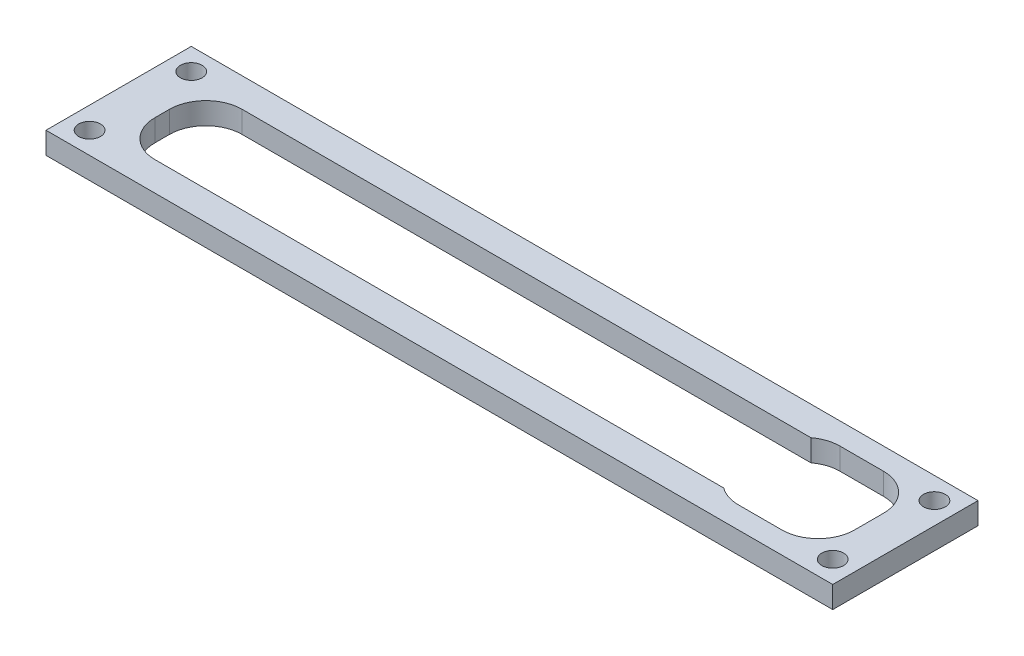
ISO-10303-21;
HEADER;
FILE_DESCRIPTION(('STEP AP214'),'2;1');
FILE_NAME('part.step','',(''),(''),'','','');
FILE_SCHEMA(('AUTOMOTIVE_DESIGN { 1 0 10303 214 1 1 1 1 }'));
ENDSEC;
DATA;
#1=APPLICATION_CONTEXT('core data for automotive mechanical design processes');
#2=APPLICATION_PROTOCOL_DEFINITION('international standard','automotive_design',2000,#1);
#3=PRODUCT_CONTEXT('',#1,'mechanical');
#4=PRODUCT('Part','Part','',(#3));
#5=PRODUCT_RELATED_PRODUCT_CATEGORY('part','',(#4));
#6=PRODUCT_DEFINITION_FORMATION('','',#4);
#7=PRODUCT_DEFINITION_CONTEXT('part definition',#1,'design');
#8=PRODUCT_DEFINITION('design','',#6,#7);
#9=PRODUCT_DEFINITION_SHAPE('','',#8);
#10=(LENGTH_UNIT() NAMED_UNIT(*) SI_UNIT(.MILLI.,.METRE.));
#11=(NAMED_UNIT(*) PLANE_ANGLE_UNIT() SI_UNIT($,.RADIAN.));
#12=(NAMED_UNIT(*) SI_UNIT($,.STERADIAN.) SOLID_ANGLE_UNIT());
#13=UNCERTAINTY_MEASURE_WITH_UNIT(LENGTH_MEASURE(1.E-05),#10,'distance_accuracy_value','');
#14=(GEOMETRIC_REPRESENTATION_CONTEXT(3) GLOBAL_UNCERTAINTY_ASSIGNED_CONTEXT((#13)) GLOBAL_UNIT_ASSIGNED_CONTEXT((#10,
#11,#12)) REPRESENTATION_CONTEXT('',''));
#15=CARTESIAN_POINT('',(0.,0.,0.));
#16=DIRECTION('',(0.,0.,1.));
#17=DIRECTION('',(1.,0.,0.));
#18=AXIS2_PLACEMENT_3D('',#15,#16,#17);
#19=CARTESIAN_POINT('',(0.,3.,0.));
#20=DIRECTION('',(0.,-1.,0.));
#21=DIRECTION('',(0.,0.,-1.));
#22=AXIS2_PLACEMENT_3D('',#19,#20,#21);
#23=PLANE('',#22);
#24=DIRECTION('',(0.,0.,1.));
#25=VECTOR('',#24,1.);
#26=CARTESIAN_POINT('',(0.,3.,0.));
#27=LINE('',#26,#25);
#28=CARTESIAN_POINT('',(0.,3.,-20.));
#29=VERTEX_POINT('',#28);
#30=CARTESIAN_POINT('',(0.,3.,0.));
#31=VERTEX_POINT('',#30);
#32=EDGE_CURVE('E249',#29,#31,#27,.T.);
#33=ORIENTED_EDGE('',*,*,#32,.T.);
#34=DIRECTION('',(1.,0.,0.));
#35=VECTOR('',#34,1.);
#36=CARTESIAN_POINT('',(0.,3.,0.));
#37=LINE('',#36,#35);
#38=CARTESIAN_POINT('',(108.320866353641,3.,0.));
#39=VERTEX_POINT('',#38);
#40=EDGE_CURVE('E252',#31,#39,#37,.T.);
#41=ORIENTED_EDGE('',*,*,#40,.T.);
#42=DIRECTION('',(0.,0.,-1.));
#43=VECTOR('',#42,1.);
#44=CARTESIAN_POINT('',(108.320866353641,3.,0.));
#45=LINE('',#44,#43);
#46=CARTESIAN_POINT('',(108.320866353641,3.,-20.));
#47=VERTEX_POINT('',#46);
#48=EDGE_CURVE('E255',#39,#47,#45,.T.);
#49=ORIENTED_EDGE('',*,*,#48,.T.);
#50=DIRECTION('',(-1.,0.,0.));
#51=VECTOR('',#50,1.);
#52=CARTESIAN_POINT('',(0.,3.,-20.));
#53=LINE('',#52,#51);
#54=EDGE_CURVE('E257',#47,#29,#53,.T.);
#55=ORIENTED_EDGE('',*,*,#54,.T.);
#56=EDGE_LOOP('',(#33,#41,#49,#55));
#57=FACE_BOUND('',#56,.T.);
#58=DIRECTION('',(-1.,0.,0.));
#59=VECTOR('',#58,1.);
#60=CARTESIAN_POINT('',(5.99999999999999,3.,-16.));
#61=LINE('',#60,#59);
#62=CARTESIAN_POINT('',(89.3208663536412,3.,-16.));
#63=VERTEX_POINT('',#62);
#64=CARTESIAN_POINT('',(11.,3.,-16.));
#65=VERTEX_POINT('',#64);
#66=EDGE_CURVE('E242',#63,#65,#61,.T.);
#67=ORIENTED_EDGE('',*,*,#66,.F.);
#68=CARTESIAN_POINT('',(92.3208663536412,3.,-12.));
#69=DIRECTION('',(0.,-1.,0.));
#70=DIRECTION('',(0.,0.,-1.));
#71=AXIS2_PLACEMENT_3D('',#68,#69,#70);
#72=CIRCLE('',#71,5.);
#73=CARTESIAN_POINT('',(92.3208663536412,3.,-17.));
#74=VERTEX_POINT('',#73);
#75=EDGE_CURVE('E192',#63,#74,#72,.T.);
#76=ORIENTED_EDGE('',*,*,#75,.T.);
#77=DIRECTION('',(-1.,0.,0.));
#78=VECTOR('',#77,1.);
#79=CARTESIAN_POINT('',(89.3208663536412,3.,-17.));
#80=LINE('',#79,#78);
#81=CARTESIAN_POINT('',(98.3208663536412,3.,-17.));
#82=VERTEX_POINT('',#81);
#83=EDGE_CURVE('E204',#82,#74,#80,.T.);
#84=ORIENTED_EDGE('',*,*,#83,.F.);
#85=CARTESIAN_POINT('',(98.3208663536412,3.,-12.));
#86=DIRECTION('',(0.,-1.,0.));
#87=DIRECTION('',(0.,0.,-1.));
#88=AXIS2_PLACEMENT_3D('',#85,#86,#87);
#89=CIRCLE('',#88,5.);
#90=CARTESIAN_POINT('',(103.320866353641,3.,-12.));
#91=VERTEX_POINT('',#90);
#92=EDGE_CURVE('E184',#82,#91,#89,.T.);
#93=ORIENTED_EDGE('',*,*,#92,.T.);
#94=DIRECTION('',(0.,0.,-1.));
#95=VECTOR('',#94,1.);
#96=CARTESIAN_POINT('',(103.320866353641,3.,-17.));
#97=LINE('',#96,#95);
#98=CARTESIAN_POINT('',(103.320866353641,3.,-8.00000000000001));
#99=VERTEX_POINT('',#98);
#100=EDGE_CURVE('E201',#99,#91,#97,.T.);
#101=ORIENTED_EDGE('',*,*,#100,.F.);
#102=CARTESIAN_POINT('',(98.3208663536412,3.,-8.00000000000001));
#103=DIRECTION('',(0.,-1.,0.));
#104=DIRECTION('',(0.,0.,-1.));
#105=AXIS2_PLACEMENT_3D('',#102,#103,#104);
#106=CIRCLE('',#105,5.);
#107=CARTESIAN_POINT('',(98.3208663536412,3.,-3.00000000000001));
#108=VERTEX_POINT('',#107);
#109=EDGE_CURVE('E188',#99,#108,#106,.T.);
#110=ORIENTED_EDGE('',*,*,#109,.T.);
#111=DIRECTION('',(1.,0.,0.));
#112=VECTOR('',#111,1.);
#113=CARTESIAN_POINT('',(89.3208663536412,3.,-3.00000000000001));
#114=LINE('',#113,#112);
#115=CARTESIAN_POINT('',(92.3208663536412,3.,-3.00000000000001));
#116=VERTEX_POINT('',#115);
#117=EDGE_CURVE('E199',#116,#108,#114,.T.);
#118=ORIENTED_EDGE('',*,*,#117,.F.);
#119=CARTESIAN_POINT('',(92.3208663536412,3.,-8.00000000000001));
#120=DIRECTION('',(0.,-1.,0.));
#121=DIRECTION('',(0.,0.,-1.));
#122=AXIS2_PLACEMENT_3D('',#119,#120,#121);
#123=CIRCLE('',#122,5.);
#124=CARTESIAN_POINT('',(89.3208663536412,3.,-4.00000000000002));
#125=VERTEX_POINT('',#124);
#126=EDGE_CURVE('E42',#116,#125,#123,.T.);
#127=ORIENTED_EDGE('',*,*,#126,.T.);
#128=DIRECTION('',(1.,0.,0.));
#129=VECTOR('',#128,1.);
#130=CARTESIAN_POINT('',(5.99999999999999,3.,-4.00000000000002));
#131=LINE('',#130,#129);
#132=CARTESIAN_POINT('',(11.,3.,-4.00000000000002));
#133=VERTEX_POINT('',#132);
#134=EDGE_CURVE('E161',#133,#125,#131,.T.);
#135=ORIENTED_EDGE('',*,*,#134,.F.);
#136=CARTESIAN_POINT('',(11.,3.,-9.00000000000001));
#137=DIRECTION('',(0.,-1.,0.));
#138=DIRECTION('',(0.,0.,-1.));
#139=AXIS2_PLACEMENT_3D('',#136,#137,#138);
#140=CIRCLE('',#139,5.);
#141=CARTESIAN_POINT('',(5.99999999999999,3.,-9.00000000000001));
#142=VERTEX_POINT('',#141);
#143=EDGE_CURVE('E178',#133,#142,#140,.T.);
#144=ORIENTED_EDGE('',*,*,#143,.T.);
#145=DIRECTION('',(0.,0.,1.));
#146=VECTOR('',#145,1.);
#147=CARTESIAN_POINT('',(5.99999999999999,3.,-16.));
#148=LINE('',#147,#146);
#149=CARTESIAN_POINT('',(5.99999999999999,3.,-11.));
#150=VERTEX_POINT('',#149);
#151=EDGE_CURVE('E238',#150,#142,#148,.T.);
#152=ORIENTED_EDGE('',*,*,#151,.F.);
#153=CARTESIAN_POINT('',(11.,3.,-11.));
#154=DIRECTION('',(0.,-1.,0.));
#155=DIRECTION('',(0.,0.,-1.));
#156=AXIS2_PLACEMENT_3D('',#153,#154,#155);
#157=CIRCLE('',#156,5.);
#158=EDGE_CURVE('E182',#150,#65,#157,.T.);
#159=ORIENTED_EDGE('',*,*,#158,.T.);
#160=EDGE_LOOP('',(#67,#76,#84,#93,#101,#110,#118,#127,#135,#144,#152,#159));
#161=FACE_BOUND('',#160,.T.);
#162=CARTESIAN_POINT('',(3.,3.,-17.));
#163=DIRECTION('',(0.,1.,0.));
#164=DIRECTION('',(0.,0.,1.));
#165=AXIS2_PLACEMENT_3D('',#162,#163,#164);
#166=CIRCLE('',#165,1.5);
#167=CARTESIAN_POINT('',(3.,3.,-15.5));
#168=VERTEX_POINT('',#167);
#169=EDGE_CURVE('E233',#168,#168,#166,.T.);
#170=ORIENTED_EDGE('',*,*,#169,.F.);
#171=EDGE_LOOP('',(#170));
#172=FACE_BOUND('',#171,.T.);
#173=CARTESIAN_POINT('',(3.,3.,-3.));
#174=DIRECTION('',(0.,1.,0.));
#175=DIRECTION('',(0.,0.,-1.));
#176=AXIS2_PLACEMENT_3D('',#173,#174,#175);
#177=CIRCLE('',#176,1.5);
#178=CARTESIAN_POINT('',(3.,3.,-4.5));
#179=VERTEX_POINT('',#178);
#180=EDGE_CURVE('E227',#179,#179,#177,.T.);
#181=ORIENTED_EDGE('',*,*,#180,.F.);
#182=EDGE_LOOP('',(#181));
#183=FACE_BOUND('',#182,.T.);
#184=CARTESIAN_POINT('',(105.320866353641,3.,-3.00000000000001));
#185=DIRECTION('',(0.,1.,0.));
#186=DIRECTION('',(0.,0.,1.));
#187=AXIS2_PLACEMENT_3D('',#184,#185,#186);
#188=CIRCLE('',#187,1.5);
#189=CARTESIAN_POINT('',(105.320866353641,3.,-1.50000000000001));
#190=VERTEX_POINT('',#189);
#191=EDGE_CURVE('E221',#190,#190,#188,.T.);
#192=ORIENTED_EDGE('',*,*,#191,.F.);
#193=EDGE_LOOP('',(#192));
#194=FACE_BOUND('',#193,.T.);
#195=CARTESIAN_POINT('',(105.320866353641,3.,-17.));
#196=DIRECTION('',(0.,1.,0.));
#197=DIRECTION('',(0.,0.,-1.));
#198=AXIS2_PLACEMENT_3D('',#195,#196,#197);
#199=CIRCLE('',#198,1.5);
#200=CARTESIAN_POINT('',(105.320866353641,3.,-18.5));
#201=VERTEX_POINT('',#200);
#202=EDGE_CURVE('E215',#201,#201,#199,.T.);
#203=ORIENTED_EDGE('',*,*,#202,.F.);
#204=EDGE_LOOP('',(#203));
#205=FACE_BOUND('',#204,.T.);
#206=ADVANCED_FACE('F34',(#57,#161,#172,#183,#194,#205),#23,.F.);
#207=CARTESIAN_POINT('',(0.,0.,0.));
#208=DIRECTION('',(0.,-1.,0.));
#209=DIRECTION('',(0.,0.,-1.));
#210=AXIS2_PLACEMENT_3D('',#207,#208,#209);
#211=PLANE('',#210);
#212=DIRECTION('',(-1.,0.,0.));
#213=VECTOR('',#212,1.);
#214=CARTESIAN_POINT('',(89.3208663536412,0.,-17.));
#215=LINE('',#214,#213);
#216=CARTESIAN_POINT('',(98.3208663536412,0.,-17.));
#217=VERTEX_POINT('',#216);
#218=CARTESIAN_POINT('',(92.3208663536412,0.,-17.));
#219=VERTEX_POINT('',#218);
#220=EDGE_CURVE('E164',#217,#219,#215,.T.);
#221=ORIENTED_EDGE('',*,*,#220,.T.);
#222=CARTESIAN_POINT('',(92.3208663536412,0.,-12.));
#223=DIRECTION('',(0.,-1.,0.));
#224=DIRECTION('',(0.,0.,-1.));
#225=AXIS2_PLACEMENT_3D('',#222,#223,#224);
#226=CIRCLE('',#225,5.);
#227=CARTESIAN_POINT('',(89.3208663536412,0.,-16.));
#228=VERTEX_POINT('',#227);
#229=EDGE_CURVE('E194',#219,#228,#226,.F.);
#230=ORIENTED_EDGE('',*,*,#229,.T.);
#231=DIRECTION('',(-1.,0.,0.));
#232=VECTOR('',#231,1.);
#233=CARTESIAN_POINT('',(5.99999999999999,0.,-16.));
#234=LINE('',#233,#232);
#235=CARTESIAN_POINT('',(11.,0.,-16.));
#236=VERTEX_POINT('',#235);
#237=EDGE_CURVE('E153',#228,#236,#234,.T.);
#238=ORIENTED_EDGE('',*,*,#237,.T.);
#239=CARTESIAN_POINT('',(11.,0.,-11.));
#240=DIRECTION('',(0.,-1.,0.));
#241=DIRECTION('',(0.,0.,-1.));
#242=AXIS2_PLACEMENT_3D('',#239,#240,#241);
#243=CIRCLE('',#242,5.);
#244=CARTESIAN_POINT('',(5.99999999999999,0.,-11.));
#245=VERTEX_POINT('',#244);
#246=EDGE_CURVE('E180',#236,#245,#243,.F.);
#247=ORIENTED_EDGE('',*,*,#246,.T.);
#248=DIRECTION('',(0.,0.,1.));
#249=VECTOR('',#248,1.);
#250=CARTESIAN_POINT('',(5.99999999999999,0.,-16.));
#251=LINE('',#250,#249);
#252=CARTESIAN_POINT('',(5.99999999999999,0.,-9.00000000000001));
#253=VERTEX_POINT('',#252);
#254=EDGE_CURVE('E154',#245,#253,#251,.T.);
#255=ORIENTED_EDGE('',*,*,#254,.T.);
#256=CARTESIAN_POINT('',(11.,0.,-9.00000000000001));
#257=DIRECTION('',(0.,-1.,0.));
#258=DIRECTION('',(0.,0.,-1.));
#259=AXIS2_PLACEMENT_3D('',#256,#257,#258);
#260=CIRCLE('',#259,5.);
#261=CARTESIAN_POINT('',(11.,0.,-4.00000000000002));
#262=VERTEX_POINT('',#261);
#263=EDGE_CURVE('E150',#253,#262,#260,.F.);
#264=ORIENTED_EDGE('',*,*,#263,.T.);
#265=DIRECTION('',(1.,0.,0.));
#266=VECTOR('',#265,1.);
#267=CARTESIAN_POINT('',(5.99999999999999,0.,-4.00000000000002));
#268=LINE('',#267,#266);
#269=CARTESIAN_POINT('',(89.3208663536412,0.,-4.00000000000002));
#270=VERTEX_POINT('',#269);
#271=EDGE_CURVE('E144',#262,#270,#268,.T.);
#272=ORIENTED_EDGE('',*,*,#271,.T.);
#273=CARTESIAN_POINT('',(92.3208663536412,0.,-8.00000000000001));
#274=DIRECTION('',(0.,-1.,0.));
#275=DIRECTION('',(0.,0.,-1.));
#276=AXIS2_PLACEMENT_3D('',#273,#274,#275);
#277=CIRCLE('',#276,5.);
#278=CARTESIAN_POINT('',(92.3208663536412,0.,-3.00000000000001));
#279=VERTEX_POINT('',#278);
#280=EDGE_CURVE('E11',#270,#279,#277,.F.);
#281=ORIENTED_EDGE('',*,*,#280,.T.);
#282=DIRECTION('',(1.,0.,0.));
#283=VECTOR('',#282,1.);
#284=CARTESIAN_POINT('',(89.3208663536412,0.,-3.00000000000001));
#285=LINE('',#284,#283);
#286=CARTESIAN_POINT('',(98.3208663536412,0.,-3.00000000000001));
#287=VERTEX_POINT('',#286);
#288=EDGE_CURVE('E211',#279,#287,#285,.T.);
#289=ORIENTED_EDGE('',*,*,#288,.T.);
#290=CARTESIAN_POINT('',(98.3208663536412,0.,-8.00000000000001));
#291=DIRECTION('',(0.,-1.,0.));
#292=DIRECTION('',(0.,0.,-1.));
#293=AXIS2_PLACEMENT_3D('',#290,#291,#292);
#294=CIRCLE('',#293,5.);
#295=CARTESIAN_POINT('',(103.320866353641,0.,-8.00000000000001));
#296=VERTEX_POINT('',#295);
#297=EDGE_CURVE('E190',#287,#296,#294,.F.);
#298=ORIENTED_EDGE('',*,*,#297,.T.);
#299=DIRECTION('',(0.,0.,-1.));
#300=VECTOR('',#299,1.);
#301=CARTESIAN_POINT('',(103.320866353641,0.,-17.));
#302=LINE('',#301,#300);
#303=CARTESIAN_POINT('',(103.320866353641,0.,-12.));
#304=VERTEX_POINT('',#303);
#305=EDGE_CURVE('E299',#296,#304,#302,.T.);
#306=ORIENTED_EDGE('',*,*,#305,.T.);
#307=CARTESIAN_POINT('',(98.3208663536412,0.,-12.));
#308=DIRECTION('',(0.,-1.,0.));
#309=DIRECTION('',(0.,0.,-1.));
#310=AXIS2_PLACEMENT_3D('',#307,#308,#309);
#311=CIRCLE('',#310,5.);
#312=EDGE_CURVE('E186',#304,#217,#311,.F.);
#313=ORIENTED_EDGE('',*,*,#312,.T.);
#314=EDGE_LOOP('',(#221,#230,#238,#247,#255,#264,#272,#281,#289,#298,#306,#313));
#315=FACE_BOUND('',#314,.T.);
#316=CARTESIAN_POINT('',(105.320866353641,0.,-3.00000000000001));
#317=DIRECTION('',(0.,1.,0.));
#318=DIRECTION('',(0.,0.,1.));
#319=AXIS2_PLACEMENT_3D('',#316,#317,#318);
#320=CIRCLE('',#319,1.5);
#321=CARTESIAN_POINT('',(105.320866353641,0.,-1.50000000000001));
#322=VERTEX_POINT('',#321);
#323=EDGE_CURVE('E218',#322,#322,#320,.T.);
#324=ORIENTED_EDGE('',*,*,#323,.T.);
#325=EDGE_LOOP('',(#324));
#326=FACE_BOUND('',#325,.T.);
#327=CARTESIAN_POINT('',(3.,0.,-17.));
#328=DIRECTION('',(0.,1.,0.));
#329=DIRECTION('',(0.,0.,1.));
#330=AXIS2_PLACEMENT_3D('',#327,#328,#329);
#331=CIRCLE('',#330,1.5);
#332=CARTESIAN_POINT('',(3.,0.,-15.5));
#333=VERTEX_POINT('',#332);
#334=EDGE_CURVE('E230',#333,#333,#331,.T.);
#335=ORIENTED_EDGE('',*,*,#334,.T.);
#336=EDGE_LOOP('',(#335));
#337=FACE_BOUND('',#336,.T.);
#338=DIRECTION('',(0.,0.,1.));
#339=VECTOR('',#338,1.);
#340=CARTESIAN_POINT('',(0.,0.,0.));
#341=LINE('',#340,#339);
#342=CARTESIAN_POINT('',(0.,0.,-20.));
#343=VERTEX_POINT('',#342);
#344=CARTESIAN_POINT('',(0.,0.,0.));
#345=VERTEX_POINT('',#344);
#346=EDGE_CURVE('E245',#343,#345,#341,.T.);
#347=ORIENTED_EDGE('',*,*,#346,.F.);
#348=DIRECTION('',(-1.,0.,0.));
#349=VECTOR('',#348,1.);
#350=CARTESIAN_POINT('',(0.,0.,-20.));
#351=LINE('',#350,#349);
#352=CARTESIAN_POINT('',(108.320866353641,0.,-20.));
#353=VERTEX_POINT('',#352);
#354=EDGE_CURVE('E253',#353,#343,#351,.T.);
#355=ORIENTED_EDGE('',*,*,#354,.F.);
#356=DIRECTION('',(0.,0.,-1.));
#357=VECTOR('',#356,1.);
#358=CARTESIAN_POINT('',(108.320866353641,0.,0.));
#359=LINE('',#358,#357);
#360=CARTESIAN_POINT('',(108.320866353641,0.,0.));
#361=VERTEX_POINT('',#360);
#362=EDGE_CURVE('E264',#361,#353,#359,.T.);
#363=ORIENTED_EDGE('',*,*,#362,.F.);
#364=DIRECTION('',(1.,0.,0.));
#365=VECTOR('',#364,1.);
#366=CARTESIAN_POINT('',(0.,0.,0.));
#367=LINE('',#366,#365);
#368=EDGE_CURVE('E262',#345,#361,#367,.T.);
#369=ORIENTED_EDGE('',*,*,#368,.F.);
#370=EDGE_LOOP('',(#347,#355,#363,#369));
#371=FACE_BOUND('',#370,.T.);
#372=CARTESIAN_POINT('',(3.,0.,-3.));
#373=DIRECTION('',(0.,1.,0.));
#374=DIRECTION('',(0.,0.,-1.));
#375=AXIS2_PLACEMENT_3D('',#372,#373,#374);
#376=CIRCLE('',#375,1.5);
#377=CARTESIAN_POINT('',(3.,0.,-4.5));
#378=VERTEX_POINT('',#377);
#379=EDGE_CURVE('E224',#378,#378,#376,.T.);
#380=ORIENTED_EDGE('',*,*,#379,.T.);
#381=EDGE_LOOP('',(#380));
#382=FACE_BOUND('',#381,.T.);
#383=CARTESIAN_POINT('',(105.320866353641,0.,-17.));
#384=DIRECTION('',(0.,1.,0.));
#385=DIRECTION('',(0.,0.,-1.));
#386=AXIS2_PLACEMENT_3D('',#383,#384,#385);
#387=CIRCLE('',#386,1.5);
#388=CARTESIAN_POINT('',(105.320866353641,0.,-18.5));
#389=VERTEX_POINT('',#388);
#390=EDGE_CURVE('E213',#389,#389,#387,.T.);
#391=ORIENTED_EDGE('',*,*,#390,.T.);
#392=EDGE_LOOP('',(#391));
#393=FACE_BOUND('',#392,.T.);
#394=ADVANCED_FACE('F147',(#315,#326,#337,#371,#382,#393),#211,.T.);
#395=CARTESIAN_POINT('',(0.,3.,0.));
#396=DIRECTION('',(1.,0.,0.));
#397=DIRECTION('',(0.,0.,-1.));
#398=AXIS2_PLACEMENT_3D('',#395,#396,#397);
#399=PLANE('',#398);
#400=ORIENTED_EDGE('',*,*,#346,.T.);
#401=DIRECTION('',(0.,-1.,0.));
#402=VECTOR('',#401,1.);
#403=CARTESIAN_POINT('',(0.,3.,0.));
#404=LINE('',#403,#402);
#405=EDGE_CURVE('E275',#31,#345,#404,.T.);
#406=ORIENTED_EDGE('',*,*,#405,.F.);
#407=ORIENTED_EDGE('',*,*,#32,.F.);
#408=DIRECTION('',(0.,-1.,0.));
#409=VECTOR('',#408,1.);
#410=CARTESIAN_POINT('',(0.,3.,-20.));
#411=LINE('',#410,#409);
#412=EDGE_CURVE('E259',#29,#343,#411,.T.);
#413=ORIENTED_EDGE('',*,*,#412,.T.);
#414=EDGE_LOOP('',(#400,#406,#407,#413));
#415=FACE_BOUND('',#414,.T.);
#416=ADVANCED_FACE('F330',(#415),#399,.F.);
#417=CARTESIAN_POINT('',(0.,3.,0.));
#418=DIRECTION('',(0.,0.,-1.));
#419=DIRECTION('',(-1.,0.,0.));
#420=AXIS2_PLACEMENT_3D('',#417,#418,#419);
#421=PLANE('',#420);
#422=ORIENTED_EDGE('',*,*,#368,.T.);
#423=DIRECTION('',(0.,-1.,0.));
#424=VECTOR('',#423,1.);
#425=CARTESIAN_POINT('',(108.320866353641,3.,0.));
#426=LINE('',#425,#424);
#427=EDGE_CURVE('E272',#39,#361,#426,.T.);
#428=ORIENTED_EDGE('',*,*,#427,.F.);
#429=ORIENTED_EDGE('',*,*,#40,.F.);
#430=ORIENTED_EDGE('',*,*,#405,.T.);
#431=EDGE_LOOP('',(#422,#428,#429,#430));
#432=FACE_BOUND('',#431,.T.);
#433=ADVANCED_FACE('F343',(#432),#421,.F.);
#434=CARTESIAN_POINT('',(108.320866353641,3.,0.));
#435=DIRECTION('',(-1.,0.,0.));
#436=DIRECTION('',(0.,0.,1.));
#437=AXIS2_PLACEMENT_3D('',#434,#435,#436);
#438=PLANE('',#437);
#439=ORIENTED_EDGE('',*,*,#362,.T.);
#440=DIRECTION('',(0.,-1.,0.));
#441=VECTOR('',#440,1.);
#442=CARTESIAN_POINT('',(108.320866353641,3.,-20.));
#443=LINE('',#442,#441);
#444=EDGE_CURVE('E269',#47,#353,#443,.T.);
#445=ORIENTED_EDGE('',*,*,#444,.F.);
#446=ORIENTED_EDGE('',*,*,#48,.F.);
#447=ORIENTED_EDGE('',*,*,#427,.T.);
#448=EDGE_LOOP('',(#439,#445,#446,#447));
#449=FACE_BOUND('',#448,.T.);
#450=ADVANCED_FACE('F339',(#449),#438,.F.);
#451=CARTESIAN_POINT('',(0.,3.,-20.));
#452=DIRECTION('',(0.,0.,1.));
#453=DIRECTION('',(1.,0.,0.));
#454=AXIS2_PLACEMENT_3D('',#451,#452,#453);
#455=PLANE('',#454);
#456=ORIENTED_EDGE('',*,*,#354,.T.);
#457=ORIENTED_EDGE('',*,*,#412,.F.);
#458=ORIENTED_EDGE('',*,*,#54,.F.);
#459=ORIENTED_EDGE('',*,*,#444,.T.);
#460=EDGE_LOOP('',(#456,#457,#458,#459));
#461=FACE_BOUND('',#460,.T.);
#462=ADVANCED_FACE('F336',(#461),#455,.F.);
#463=CARTESIAN_POINT('',(5.99999999999999,3.,-16.));
#464=DIRECTION('',(1.,0.,0.));
#465=DIRECTION('',(0.,0.,-1.));
#466=AXIS2_PLACEMENT_3D('',#463,#464,#465);
#467=PLANE('',#466);
#468=ORIENTED_EDGE('',*,*,#151,.T.);
#469=DIRECTION('',(0.,-1.,0.));
#470=VECTOR('',#469,1.);
#471=CARTESIAN_POINT('',(5.99999999999999,0.,-9.00000000000001));
#472=LINE('',#471,#470);
#473=EDGE_CURVE('E280',#142,#253,#472,.T.);
#474=ORIENTED_EDGE('',*,*,#473,.T.);
#475=ORIENTED_EDGE('',*,*,#254,.F.);
#476=DIRECTION('',(0.,-1.,0.));
#477=VECTOR('',#476,1.);
#478=CARTESIAN_POINT('',(5.99999999999999,3.,-11.));
#479=LINE('',#478,#477);
#480=EDGE_CURVE('E278',#245,#150,#479,.F.);
#481=ORIENTED_EDGE('',*,*,#480,.T.);
#482=EDGE_LOOP('',(#468,#474,#475,#481));
#483=FACE_BOUND('',#482,.T.);
#484=ADVANCED_FACE('F333',(#483),#467,.T.);
#485=CARTESIAN_POINT('',(5.99999999999999,3.,-4.00000000000002));
#486=DIRECTION('',(0.,0.,-1.));
#487=DIRECTION('',(-1.,0.,0.));
#488=AXIS2_PLACEMENT_3D('',#485,#486,#487);
#489=PLANE('',#488);
#490=ORIENTED_EDGE('',*,*,#271,.F.);
#491=DIRECTION('',(0.,-1.,0.));
#492=VECTOR('',#491,1.);
#493=CARTESIAN_POINT('',(11.,3.,-4.00000000000002));
#494=LINE('',#493,#492);
#495=EDGE_CURVE('E283',#262,#133,#494,.F.);
#496=ORIENTED_EDGE('',*,*,#495,.T.);
#497=ORIENTED_EDGE('',*,*,#134,.T.);
#498=DIRECTION('',(0.,1.,0.));
#499=VECTOR('',#498,1.);
#500=CARTESIAN_POINT('',(89.3208663536412,0.,-4.00000000000002));
#501=LINE('',#500,#499);
#502=EDGE_CURVE('E158',#270,#125,#501,.T.);
#503=ORIENTED_EDGE('',*,*,#502,.F.);
#504=EDGE_LOOP('',(#490,#496,#497,#503));
#505=FACE_BOUND('',#504,.T.);
#506=ADVANCED_FACE('F159',(#505),#489,.T.);
#507=CARTESIAN_POINT('',(5.99999999999999,3.,-16.));
#508=DIRECTION('',(0.,0.,1.));
#509=DIRECTION('',(1.,0.,0.));
#510=AXIS2_PLACEMENT_3D('',#507,#508,#509);
#511=PLANE('',#510);
#512=ORIENTED_EDGE('',*,*,#66,.T.);
#513=DIRECTION('',(0.,-1.,0.));
#514=VECTOR('',#513,1.);
#515=CARTESIAN_POINT('',(11.,0.,-16.));
#516=LINE('',#515,#514);
#517=EDGE_CURVE('E285',#65,#236,#516,.T.);
#518=ORIENTED_EDGE('',*,*,#517,.T.);
#519=ORIENTED_EDGE('',*,*,#237,.F.);
#520=DIRECTION('',(0.,1.,0.));
#521=VECTOR('',#520,1.);
#522=CARTESIAN_POINT('',(89.3208663536412,0.,-16.));
#523=LINE('',#522,#521);
#524=EDGE_CURVE('E163',#228,#63,#523,.T.);
#525=ORIENTED_EDGE('',*,*,#524,.T.);
#526=EDGE_LOOP('',(#512,#518,#519,#525));
#527=FACE_BOUND('',#526,.T.);
#528=ADVANCED_FACE('F365',(#527),#511,.T.);
#529=CARTESIAN_POINT('',(3.,3.,-17.));
#530=DIRECTION('',(0.,-1.,0.));
#531=DIRECTION('',(0.,0.,-1.));
#532=AXIS2_PLACEMENT_3D('',#529,#530,#531);
#533=CYLINDRICAL_SURFACE('',#532,1.5);
#534=ORIENTED_EDGE('',*,*,#169,.T.);
#535=EDGE_LOOP('',(#534));
#536=FACE_BOUND('',#535,.T.);
#537=ORIENTED_EDGE('',*,*,#334,.F.);
#538=EDGE_LOOP('',(#537));
#539=FACE_BOUND('',#538,.T.);
#540=ADVANCED_FACE('F378',(#536,#539),#533,.F.);
#541=CARTESIAN_POINT('',(3.,3.,-3.));
#542=DIRECTION('',(0.,-1.,0.));
#543=DIRECTION('',(0.,0.,-1.));
#544=AXIS2_PLACEMENT_3D('',#541,#542,#543);
#545=CYLINDRICAL_SURFACE('',#544,1.5);
#546=ORIENTED_EDGE('',*,*,#180,.T.);
#547=EDGE_LOOP('',(#546));
#548=FACE_BOUND('',#547,.T.);
#549=ORIENTED_EDGE('',*,*,#379,.F.);
#550=EDGE_LOOP('',(#549));
#551=FACE_BOUND('',#550,.T.);
#552=ADVANCED_FACE('F383',(#548,#551),#545,.F.);
#553=CARTESIAN_POINT('',(105.320866353641,3.,-3.00000000000001));
#554=DIRECTION('',(0.,-1.,0.));
#555=DIRECTION('',(0.,0.,-1.));
#556=AXIS2_PLACEMENT_3D('',#553,#554,#555);
#557=CYLINDRICAL_SURFACE('',#556,1.5);
#558=ORIENTED_EDGE('',*,*,#191,.T.);
#559=EDGE_LOOP('',(#558));
#560=FACE_BOUND('',#559,.T.);
#561=ORIENTED_EDGE('',*,*,#323,.F.);
#562=EDGE_LOOP('',(#561));
#563=FACE_BOUND('',#562,.T.);
#564=ADVANCED_FACE('F387',(#560,#563),#557,.F.);
#565=CARTESIAN_POINT('',(105.320866353641,3.,-17.));
#566=DIRECTION('',(0.,-1.,0.));
#567=DIRECTION('',(0.,0.,-1.));
#568=AXIS2_PLACEMENT_3D('',#565,#566,#567);
#569=CYLINDRICAL_SURFACE('',#568,1.5);
#570=ORIENTED_EDGE('',*,*,#202,.T.);
#571=EDGE_LOOP('',(#570));
#572=FACE_BOUND('',#571,.T.);
#573=ORIENTED_EDGE('',*,*,#390,.F.);
#574=EDGE_LOOP('',(#573));
#575=FACE_BOUND('',#574,.T.);
#576=ADVANCED_FACE('F391',(#572,#575),#569,.F.);
#577=CARTESIAN_POINT('',(89.3208663536412,0.,-17.));
#578=DIRECTION('',(0.,0.,-1.));
#579=DIRECTION('',(-1.,0.,0.));
#580=AXIS2_PLACEMENT_3D('',#577,#578,#579);
#581=PLANE('',#580);
#582=ORIENTED_EDGE('',*,*,#220,.F.);
#583=DIRECTION('',(0.,1.,0.));
#584=VECTOR('',#583,1.);
#585=CARTESIAN_POINT('',(98.3208663536412,3.,-17.));
#586=LINE('',#585,#584);
#587=EDGE_CURVE('E290',#217,#82,#586,.T.);
#588=ORIENTED_EDGE('',*,*,#587,.T.);
#589=ORIENTED_EDGE('',*,*,#83,.T.);
#590=DIRECTION('',(0.,1.,0.));
#591=VECTOR('',#590,1.);
#592=CARTESIAN_POINT('',(92.3208663536412,0.,-17.));
#593=LINE('',#592,#591);
#594=EDGE_CURVE('E288',#74,#219,#593,.F.);
#595=ORIENTED_EDGE('',*,*,#594,.T.);
#596=EDGE_LOOP('',(#582,#588,#589,#595));
#597=FACE_BOUND('',#596,.T.);
#598=ADVANCED_FACE('F309',(#597),#581,.F.);
#599=CARTESIAN_POINT('',(103.320866353641,0.,-17.));
#600=DIRECTION('',(1.,0.,0.));
#601=DIRECTION('',(0.,0.,-1.));
#602=AXIS2_PLACEMENT_3D('',#599,#600,#601);
#603=PLANE('',#602);
#604=ORIENTED_EDGE('',*,*,#100,.T.);
#605=DIRECTION('',(0.,1.,0.));
#606=VECTOR('',#605,1.);
#607=CARTESIAN_POINT('',(103.320866353641,0.,-12.));
#608=LINE('',#607,#606);
#609=EDGE_CURVE('E170',#91,#304,#608,.F.);
#610=ORIENTED_EDGE('',*,*,#609,.T.);
#611=ORIENTED_EDGE('',*,*,#305,.F.);
#612=DIRECTION('',(0.,1.,0.));
#613=VECTOR('',#612,1.);
#614=CARTESIAN_POINT('',(103.320866353641,3.,-8.00000000000001));
#615=LINE('',#614,#613);
#616=EDGE_CURVE('E173',#296,#99,#615,.T.);
#617=ORIENTED_EDGE('',*,*,#616,.T.);
#618=EDGE_LOOP('',(#604,#610,#611,#617));
#619=FACE_BOUND('',#618,.T.);
#620=ADVANCED_FACE('F296',(#619),#603,.F.);
#621=CARTESIAN_POINT('',(89.3208663536412,0.,-3.00000000000001));
#622=DIRECTION('',(0.,0.,1.));
#623=DIRECTION('',(1.,0.,0.));
#624=AXIS2_PLACEMENT_3D('',#621,#622,#623);
#625=PLANE('',#624);
#626=ORIENTED_EDGE('',*,*,#117,.T.);
#627=DIRECTION('',(0.,1.,0.));
#628=VECTOR('',#627,1.);
#629=CARTESIAN_POINT('',(98.3208663536412,0.,-3.00000000000001));
#630=LINE('',#629,#628);
#631=EDGE_CURVE('E49',#108,#287,#630,.F.);
#632=ORIENTED_EDGE('',*,*,#631,.T.);
#633=ORIENTED_EDGE('',*,*,#288,.F.);
#634=DIRECTION('',(0.,-1.,0.));
#635=VECTOR('',#634,1.);
#636=CARTESIAN_POINT('',(92.3208663536412,0.,-3.00000000000001));
#637=LINE('',#636,#635);
#638=EDGE_CURVE('E168',#279,#116,#637,.F.);
#639=ORIENTED_EDGE('',*,*,#638,.T.);
#640=EDGE_LOOP('',(#626,#632,#633,#639));
#641=FACE_BOUND('',#640,.T.);
#642=ADVANCED_FACE('F354',(#641),#625,.F.);
#643=CARTESIAN_POINT('',(11.,3.,-9.00000000000001));
#644=DIRECTION('',(0.,1.,0.));
#645=DIRECTION('',(0.,0.,1.));
#646=AXIS2_PLACEMENT_3D('',#643,#644,#645);
#647=CYLINDRICAL_SURFACE('',#646,5.);
#648=ORIENTED_EDGE('',*,*,#143,.F.);
#649=ORIENTED_EDGE('',*,*,#495,.F.);
#650=ORIENTED_EDGE('',*,*,#263,.F.);
#651=ORIENTED_EDGE('',*,*,#473,.F.);
#652=EDGE_LOOP('',(#648,#649,#650,#651));
#653=FACE_BOUND('',#652,.T.);
#654=ADVANCED_FACE('F351',(#653),#647,.F.);
#655=CARTESIAN_POINT('',(11.,3.,-11.));
#656=DIRECTION('',(0.,1.,0.));
#657=DIRECTION('',(0.,0.,1.));
#658=AXIS2_PLACEMENT_3D('',#655,#656,#657);
#659=CYLINDRICAL_SURFACE('',#658,5.);
#660=ORIENTED_EDGE('',*,*,#158,.F.);
#661=ORIENTED_EDGE('',*,*,#480,.F.);
#662=ORIENTED_EDGE('',*,*,#246,.F.);
#663=ORIENTED_EDGE('',*,*,#517,.F.);
#664=EDGE_LOOP('',(#660,#661,#662,#663));
#665=FACE_BOUND('',#664,.T.);
#666=ADVANCED_FACE('F322',(#665),#659,.F.);
#667=CARTESIAN_POINT('',(98.3208663536412,0.,-12.));
#668=DIRECTION('',(0.,-1.,0.));
#669=DIRECTION('',(0.,0.,-1.));
#670=AXIS2_PLACEMENT_3D('',#667,#668,#669);
#671=CYLINDRICAL_SURFACE('',#670,5.);
#672=ORIENTED_EDGE('',*,*,#312,.F.);
#673=ORIENTED_EDGE('',*,*,#609,.F.);
#674=ORIENTED_EDGE('',*,*,#92,.F.);
#675=ORIENTED_EDGE('',*,*,#587,.F.);
#676=EDGE_LOOP('',(#672,#673,#674,#675));
#677=FACE_BOUND('',#676,.T.);
#678=ADVANCED_FACE('F306',(#677),#671,.F.);
#679=CARTESIAN_POINT('',(98.3208663536412,0.,-8.00000000000001));
#680=DIRECTION('',(0.,-1.,0.));
#681=DIRECTION('',(0.,0.,-1.));
#682=AXIS2_PLACEMENT_3D('',#679,#680,#681);
#683=CYLINDRICAL_SURFACE('',#682,5.);
#684=ORIENTED_EDGE('',*,*,#297,.F.);
#685=ORIENTED_EDGE('',*,*,#631,.F.);
#686=ORIENTED_EDGE('',*,*,#109,.F.);
#687=ORIENTED_EDGE('',*,*,#616,.F.);
#688=EDGE_LOOP('',(#684,#685,#686,#687));
#689=FACE_BOUND('',#688,.T.);
#690=ADVANCED_FACE('F313',(#689),#683,.F.);
#691=CARTESIAN_POINT('',(92.3208663536412,0.,-12.));
#692=DIRECTION('',(0.,1.,0.));
#693=DIRECTION('',(0.,0.,1.));
#694=AXIS2_PLACEMENT_3D('',#691,#692,#693);
#695=CYLINDRICAL_SURFACE('',#694,5.);
#696=ORIENTED_EDGE('',*,*,#229,.F.);
#697=ORIENTED_EDGE('',*,*,#594,.F.);
#698=ORIENTED_EDGE('',*,*,#75,.F.);
#699=ORIENTED_EDGE('',*,*,#524,.F.);
#700=EDGE_LOOP('',(#696,#697,#698,#699));
#701=FACE_BOUND('',#700,.T.);
#702=ADVANCED_FACE('F315',(#701),#695,.F.);
#703=CARTESIAN_POINT('',(92.3208663536412,0.,-8.00000000000001));
#704=DIRECTION('',(0.,-1.,0.));
#705=DIRECTION('',(0.,0.,-1.));
#706=AXIS2_PLACEMENT_3D('',#703,#704,#705);
#707=CYLINDRICAL_SURFACE('',#706,5.);
#708=ORIENTED_EDGE('',*,*,#280,.F.);
#709=ORIENTED_EDGE('',*,*,#502,.T.);
#710=ORIENTED_EDGE('',*,*,#126,.F.);
#711=ORIENTED_EDGE('',*,*,#638,.F.);
#712=EDGE_LOOP('',(#708,#709,#710,#711));
#713=FACE_BOUND('',#712,.T.);
#714=ADVANCED_FACE('F36',(#713),#707,.F.);
#715=CLOSED_SHELL('',(#206,#394,#416,#433,#450,#462,#484,#506,#528,#540,#552,#564,#576,#598,
#620,#642,#654,#666,#678,#690,#702,#714));
#716=MANIFOLD_SOLID_BREP('B2',#715);
#717=ADVANCED_BREP_SHAPE_REPRESENTATION('',(#18,#716),#14);
#718=SHAPE_DEFINITION_REPRESENTATION(#9,#717);
ENDSEC;
END-ISO-10303-21;
